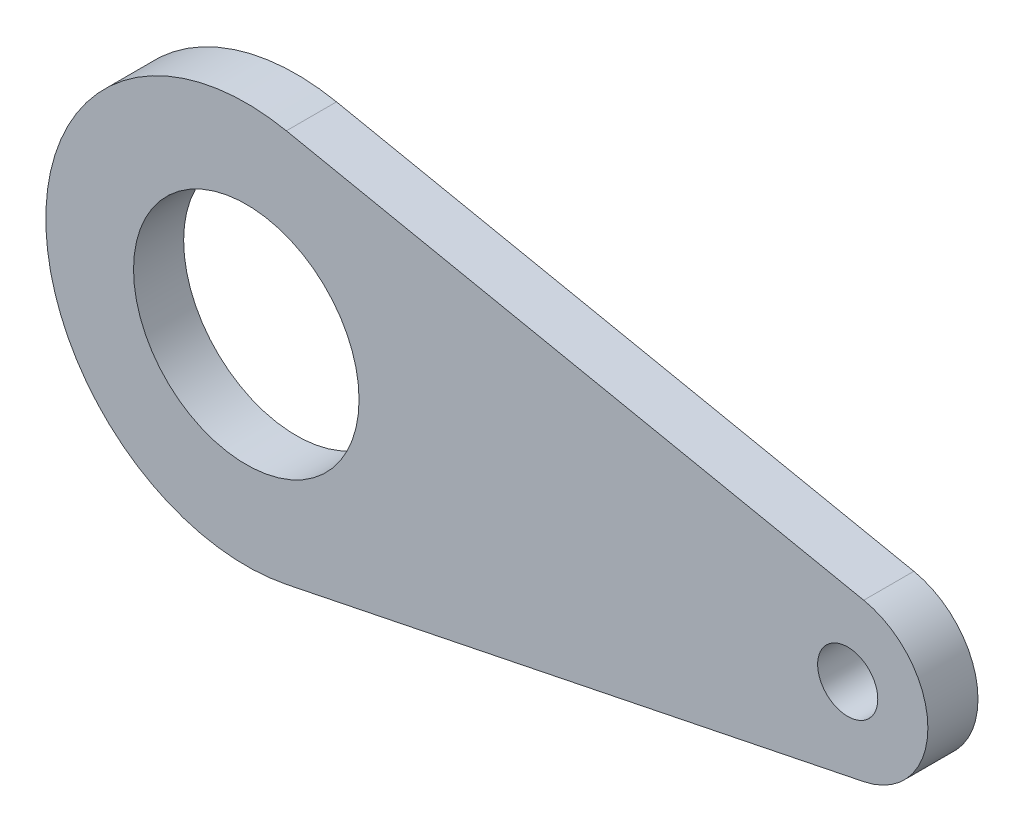
ISO-10303-21;
HEADER;
FILE_DESCRIPTION(('STEP AP214'),'2;1');
FILE_NAME('part.step','',(''),(''),'','','');
FILE_SCHEMA(('AUTOMOTIVE_DESIGN { 1 0 10303 214 1 1 1 1 }'));
ENDSEC;
DATA;
#1=APPLICATION_CONTEXT('core data for automotive mechanical design processes');
#2=APPLICATION_PROTOCOL_DEFINITION('international standard','automotive_design',2000,#1);
#3=PRODUCT_CONTEXT('',#1,'mechanical');
#4=PRODUCT('Part','Part','',(#3));
#5=PRODUCT_RELATED_PRODUCT_CATEGORY('part','',(#4));
#6=PRODUCT_DEFINITION_FORMATION('','',#4);
#7=PRODUCT_DEFINITION_CONTEXT('part definition',#1,'design');
#8=PRODUCT_DEFINITION('design','',#6,#7);
#9=PRODUCT_DEFINITION_SHAPE('','',#8);
#10=(LENGTH_UNIT() NAMED_UNIT(*) SI_UNIT(.MILLI.,.METRE.));
#11=(NAMED_UNIT(*) PLANE_ANGLE_UNIT() SI_UNIT($,.RADIAN.));
#12=(NAMED_UNIT(*) SI_UNIT($,.STERADIAN.) SOLID_ANGLE_UNIT());
#13=UNCERTAINTY_MEASURE_WITH_UNIT(LENGTH_MEASURE(1.E-05),#10,'distance_accuracy_value','');
#14=(GEOMETRIC_REPRESENTATION_CONTEXT(3) GLOBAL_UNCERTAINTY_ASSIGNED_CONTEXT((#13)) GLOBAL_UNIT_ASSIGNED_CONTEXT((#10,
#11,#12)) REPRESENTATION_CONTEXT('',''));
#15=CARTESIAN_POINT('',(0.,0.,0.));
#16=DIRECTION('',(0.,0.,1.));
#17=DIRECTION('',(1.,0.,0.));
#18=AXIS2_PLACEMENT_3D('',#15,#16,#17);
#19=CARTESIAN_POINT('',(2.22044604925031E-13,-1.11022302462516E-13,5.00000000000037));
#20=DIRECTION('',(0.,0.,1.));
#21=DIRECTION('',(1.00000000000002,0.,0.));
#22=AXIS2_PLACEMENT_3D('',#19,#20,#21);
#23=PLANE('',#22);
#24=CARTESIAN_POINT('',(120.000000000007,-1.4432899320127E-12,5.00000000000092));
#25=DIRECTION('',(0.,0.,1.));
#26=DIRECTION('',(1.00000000000002,0.,0.));
#27=AXIS2_PLACEMENT_3D('',#24,#25,#26);
#28=CIRCLE('',#27,6.00000000000004);
#29=CARTESIAN_POINT('',(126.000000000008,-1.40232270240403E-12,5.00000000000091));
#30=VERTEX_POINT('',#29);
#31=EDGE_CURVE('E91',#30,#30,#28,.T.);
#32=ORIENTED_EDGE('',*,*,#31,.F.);
#33=EDGE_LOOP('',(#32));
#34=FACE_BOUND('',#33,.T.);
#35=CARTESIAN_POINT('',(2.22044604925031E-13,-1.11022302462516E-13,5.00000000000037));
#36=DIRECTION('',(0.,0.,1.));
#37=DIRECTION('',(1.00000000000002,0.,0.));
#38=AXIS2_PLACEMENT_3D('',#35,#36,#37);
#39=CIRCLE('',#38,40.);
#40=CARTESIAN_POINT('',(8.00000000000034,39.1918358845307,5.00000000000006));
#41=VERTEX_POINT('',#40);
#42=CARTESIAN_POINT('',(8.00000000000256,-39.1918358845307,5.00000000000131));
#43=VERTEX_POINT('',#42);
#44=EDGE_CURVE('E101',#41,#43,#39,.T.);
#45=ORIENTED_EDGE('',*,*,#44,.T.);
#46=DIRECTION('',(0.979795897113292,0.200000000000007,0.));
#47=VECTOR('',#46,1.);
#48=CARTESIAN_POINT('',(8.00000000000256,-39.1918358845307,5.00000000000131));
#49=LINE('',#48,#47);
#50=CARTESIAN_POINT('',(123.200000000007,-15.6767343538131,5.00000000000156));
#51=VERTEX_POINT('',#50);
#52=EDGE_CURVE('E86',#43,#51,#49,.T.);
#53=ORIENTED_EDGE('',*,*,#52,.T.);
#54=CARTESIAN_POINT('',(120.000000000007,-1.4432899320127E-12,5.00000000000092));
#55=DIRECTION('',(0.,0.,1.));
#56=DIRECTION('',(1.00000000000002,0.,0.));
#57=AXIS2_PLACEMENT_3D('',#54,#55,#56);
#58=CIRCLE('',#57,16.);
#59=CARTESIAN_POINT('',(123.200000000007,15.6767343538107,5.00000000000148));
#60=VERTEX_POINT('',#59);
#61=EDGE_CURVE('E52',#51,#60,#58,.T.);
#62=ORIENTED_EDGE('',*,*,#61,.T.);
#63=DIRECTION('',(-0.97979589711329,0.199999999999994,0.));
#64=VECTOR('',#63,1.);
#65=CARTESIAN_POINT('',(8.00000000000034,39.1918358845307,5.00000000000006));
#66=LINE('',#65,#64);
#67=EDGE_CURVE('E47',#60,#41,#66,.T.);
#68=ORIENTED_EDGE('',*,*,#67,.T.);
#69=EDGE_LOOP('',(#45,#53,#62,#68));
#70=FACE_BOUND('',#69,.T.);
#71=CARTESIAN_POINT('',(2.22044604925031E-13,-1.11022302462516E-13,5.00000000000037));
#72=DIRECTION('',(0.,0.,1.));
#73=DIRECTION('',(1.00000000000002,0.,0.));
#74=AXIS2_PLACEMENT_3D('',#71,#72,#73);
#75=CIRCLE('',#74,22.5);
#76=CARTESIAN_POINT('',(22.5000000000007,0.,5.00000000000034));
#77=VERTEX_POINT('',#76);
#78=EDGE_CURVE('E119',#77,#77,#75,.T.);
#79=ORIENTED_EDGE('',*,*,#78,.F.);
#80=EDGE_LOOP('',(#79));
#81=FACE_BOUND('',#80,.T.);
#82=ADVANCED_FACE('F32',(#34,#70,#81),#23,.T.);
#83=CARTESIAN_POINT('',(1.55431223447522E-12,-7.7715611723761E-13,-4.99999999999917));
#84=DIRECTION('',(0.,0.,1.));
#85=DIRECTION('',(1.00000000000002,0.,0.));
#86=AXIS2_PLACEMENT_3D('',#83,#84,#85);
#87=PLANE('',#86);
#88=CARTESIAN_POINT('',(120.000000000007,-2.44249065417534E-12,-4.99999999999828));
#89=DIRECTION('',(0.,0.,1.));
#90=DIRECTION('',(1.00000000000002,0.,0.));
#91=AXIS2_PLACEMENT_3D('',#88,#89,#90);
#92=CIRCLE('',#91,6.00000000000004);
#93=CARTESIAN_POINT('',(126.000000000007,-2.40152342456668E-12,-4.99999999999829));
#94=VERTEX_POINT('',#93);
#95=EDGE_CURVE('E94',#94,#94,#92,.T.);
#96=ORIENTED_EDGE('',*,*,#95,.T.);
#97=EDGE_LOOP('',(#96));
#98=FACE_BOUND('',#97,.T.);
#99=CARTESIAN_POINT('',(1.55431223447522E-12,-7.7715611723761E-13,-4.99999999999917));
#100=DIRECTION('',(0.,0.,1.));
#101=DIRECTION('',(1.00000000000002,0.,0.));
#102=AXIS2_PLACEMENT_3D('',#99,#100,#101);
#103=CIRCLE('',#102,40.);
#104=CARTESIAN_POINT('',(8.00000000000245,39.1918358845293,-4.99999999999892));
#105=VERTEX_POINT('',#104);
#106=CARTESIAN_POINT('',(8.00000000000278,-39.191835884532,-4.99999999999801));
#107=VERTEX_POINT('',#106);
#108=EDGE_CURVE('E78',#105,#107,#103,.T.);
#109=ORIENTED_EDGE('',*,*,#108,.F.);
#110=DIRECTION('',(-0.97979589711329,0.199999999999994,0.));
#111=VECTOR('',#110,1.);
#112=CARTESIAN_POINT('',(8.00000000000245,39.1918358845293,-4.99999999999892));
#113=LINE('',#112,#111);
#114=CARTESIAN_POINT('',(123.200000000008,15.6767343538122,-4.99999999999914));
#115=VERTEX_POINT('',#114);
#116=EDGE_CURVE('E99',#115,#105,#113,.T.);
#117=ORIENTED_EDGE('',*,*,#116,.F.);
#118=CARTESIAN_POINT('',(120.000000000007,-2.44249065417534E-12,-4.99999999999828));
#119=DIRECTION('',(0.,0.,1.));
#120=DIRECTION('',(1.00000000000002,0.,0.));
#121=AXIS2_PLACEMENT_3D('',#118,#119,#120);
#122=CIRCLE('',#121,16.);
#123=CARTESIAN_POINT('',(123.200000000007,-15.6767343538147,-4.99999999999878));
#124=VERTEX_POINT('',#123);
#125=EDGE_CURVE('E79',#124,#115,#122,.T.);
#126=ORIENTED_EDGE('',*,*,#125,.F.);
#127=DIRECTION('',(0.979795897113292,0.200000000000007,0.));
#128=VECTOR('',#127,1.);
#129=CARTESIAN_POINT('',(8.00000000000278,-39.191835884532,-4.99999999999801));
#130=LINE('',#129,#128);
#131=EDGE_CURVE('E73',#107,#124,#130,.T.);
#132=ORIENTED_EDGE('',*,*,#131,.F.);
#133=EDGE_LOOP('',(#109,#117,#126,#132));
#134=FACE_BOUND('',#133,.T.);
#135=CARTESIAN_POINT('',(1.55431223447522E-12,-7.7715611723761E-13,-4.99999999999917));
#136=DIRECTION('',(0.,0.,1.));
#137=DIRECTION('',(1.00000000000002,0.,0.));
#138=AXIS2_PLACEMENT_3D('',#135,#136,#137);
#139=CIRCLE('',#138,22.5);
#140=CARTESIAN_POINT('',(22.500000000002,-6.23529006205104E-13,-4.99999999999919));
#141=VERTEX_POINT('',#140);
#142=EDGE_CURVE('E121',#141,#141,#139,.T.);
#143=ORIENTED_EDGE('',*,*,#142,.T.);
#144=EDGE_LOOP('',(#143));
#145=FACE_BOUND('',#144,.T.);
#146=ADVANCED_FACE('F74',(#98,#134,#145),#87,.F.);
#147=CARTESIAN_POINT('',(2.22044604925031E-13,-1.11022302462516E-13,5.00000000000037));
#148=DIRECTION('',(0.,0.,-1.));
#149=DIRECTION('',(-1.00000000000002,0.,0.));
#150=AXIS2_PLACEMENT_3D('',#147,#148,#149);
#151=CYLINDRICAL_SURFACE('',#150,40.);
#152=ORIENTED_EDGE('',*,*,#108,.T.);
#153=DIRECTION('',(0.,0.,-1.));
#154=VECTOR('',#153,1.);
#155=CARTESIAN_POINT('',(8.00000000000256,-39.1918358845307,5.00000000000131));
#156=LINE('',#155,#154);
#157=EDGE_CURVE('E11',#43,#107,#156,.T.);
#158=ORIENTED_EDGE('',*,*,#157,.F.);
#159=ORIENTED_EDGE('',*,*,#44,.F.);
#160=DIRECTION('',(0.,0.,-1.));
#161=VECTOR('',#160,1.);
#162=CARTESIAN_POINT('',(8.00000000000034,39.1918358845307,5.00000000000006));
#163=LINE('',#162,#161);
#164=EDGE_CURVE('E90',#41,#105,#163,.T.);
#165=ORIENTED_EDGE('',*,*,#164,.T.);
#166=EDGE_LOOP('',(#152,#158,#159,#165));
#167=FACE_BOUND('',#166,.T.);
#168=ADVANCED_FACE('F34',(#167),#151,.T.);
#169=CARTESIAN_POINT('',(8.00000000000256,-39.1918358845307,5.00000000000131));
#170=DIRECTION('',(-0.199999999999999,0.979795897113271,0.));
#171=DIRECTION('',(-0.979795897113293,-0.200000000000007,0.));
#172=AXIS2_PLACEMENT_3D('',#169,#170,#171);
#173=PLANE('',#172);
#174=ORIENTED_EDGE('',*,*,#131,.T.);
#175=DIRECTION('',(0.,0.,-1.));
#176=VECTOR('',#175,1.);
#177=CARTESIAN_POINT('',(123.200000000007,-15.6767343538131,5.00000000000156));
#178=LINE('',#177,#176);
#179=EDGE_CURVE('E40',#51,#124,#178,.T.);
#180=ORIENTED_EDGE('',*,*,#179,.F.);
#181=ORIENTED_EDGE('',*,*,#52,.F.);
#182=ORIENTED_EDGE('',*,*,#157,.T.);
#183=EDGE_LOOP('',(#174,#180,#181,#182));
#184=FACE_BOUND('',#183,.T.);
#185=ADVANCED_FACE('F85',(#184),#173,.F.);
#186=CARTESIAN_POINT('',(120.000000000007,-1.4432899320127E-12,5.00000000000092));
#187=DIRECTION('',(0.,0.,-1.));
#188=DIRECTION('',(-1.00000000000002,0.,0.));
#189=AXIS2_PLACEMENT_3D('',#186,#187,#188);
#190=CYLINDRICAL_SURFACE('',#189,16.);
#191=ORIENTED_EDGE('',*,*,#125,.T.);
#192=DIRECTION('',(0.,0.,-1.));
#193=VECTOR('',#192,1.);
#194=CARTESIAN_POINT('',(123.200000000007,15.6767343538107,5.00000000000148));
#195=LINE('',#194,#193);
#196=EDGE_CURVE('E107',#60,#115,#195,.T.);
#197=ORIENTED_EDGE('',*,*,#196,.F.);
#198=ORIENTED_EDGE('',*,*,#61,.F.);
#199=ORIENTED_EDGE('',*,*,#179,.T.);
#200=EDGE_LOOP('',(#191,#197,#198,#199));
#201=FACE_BOUND('',#200,.T.);
#202=ADVANCED_FACE('F110',(#201),#190,.T.);
#203=CARTESIAN_POINT('',(8.00000000000034,39.1918358845307,5.00000000000006));
#204=DIRECTION('',(-0.20000000000001,-0.979795897113273,0.));
#205=DIRECTION('',(0.979795897113289,-0.199999999999994,0.));
#206=AXIS2_PLACEMENT_3D('',#203,#204,#205);
#207=PLANE('',#206);
#208=ORIENTED_EDGE('',*,*,#116,.T.);
#209=ORIENTED_EDGE('',*,*,#164,.F.);
#210=ORIENTED_EDGE('',*,*,#67,.F.);
#211=ORIENTED_EDGE('',*,*,#196,.T.);
#212=EDGE_LOOP('',(#208,#209,#210,#211));
#213=FACE_BOUND('',#212,.T.);
#214=ADVANCED_FACE('F112',(#213),#207,.F.);
#215=CARTESIAN_POINT('',(120.000000000007,-1.4432899320127E-12,5.00000000000092));
#216=DIRECTION('',(0.,0.,-1.));
#217=DIRECTION('',(-1.00000000000002,0.,0.));
#218=AXIS2_PLACEMENT_3D('',#215,#216,#217);
#219=CYLINDRICAL_SURFACE('',#218,6.00000000000004);
#220=ORIENTED_EDGE('',*,*,#31,.T.);
#221=EDGE_LOOP('',(#220));
#222=FACE_BOUND('',#221,.T.);
#223=ORIENTED_EDGE('',*,*,#95,.F.);
#224=EDGE_LOOP('',(#223));
#225=FACE_BOUND('',#224,.T.);
#226=ADVANCED_FACE('F130',(#222,#225),#219,.F.);
#227=CARTESIAN_POINT('',(2.22044604925031E-13,-1.11022302462516E-13,5.00000000000037));
#228=DIRECTION('',(0.,0.,-1.));
#229=DIRECTION('',(-1.00000000000002,0.,0.));
#230=AXIS2_PLACEMENT_3D('',#227,#228,#229);
#231=CYLINDRICAL_SURFACE('',#230,22.5);
#232=ORIENTED_EDGE('',*,*,#78,.T.);
#233=EDGE_LOOP('',(#232));
#234=FACE_BOUND('',#233,.T.);
#235=ORIENTED_EDGE('',*,*,#142,.F.);
#236=EDGE_LOOP('',(#235));
#237=FACE_BOUND('',#236,.T.);
#238=ADVANCED_FACE('F128',(#234,#237),#231,.F.);
#239=CLOSED_SHELL('',(#82,#146,#168,#185,#202,#214,#226,#238));
#240=MANIFOLD_SOLID_BREP('B2',#239);
#241=ADVANCED_BREP_SHAPE_REPRESENTATION('',(#18,#240),#14);
#242=SHAPE_DEFINITION_REPRESENTATION(#9,#241);
ENDSEC;
END-ISO-10303-21;
